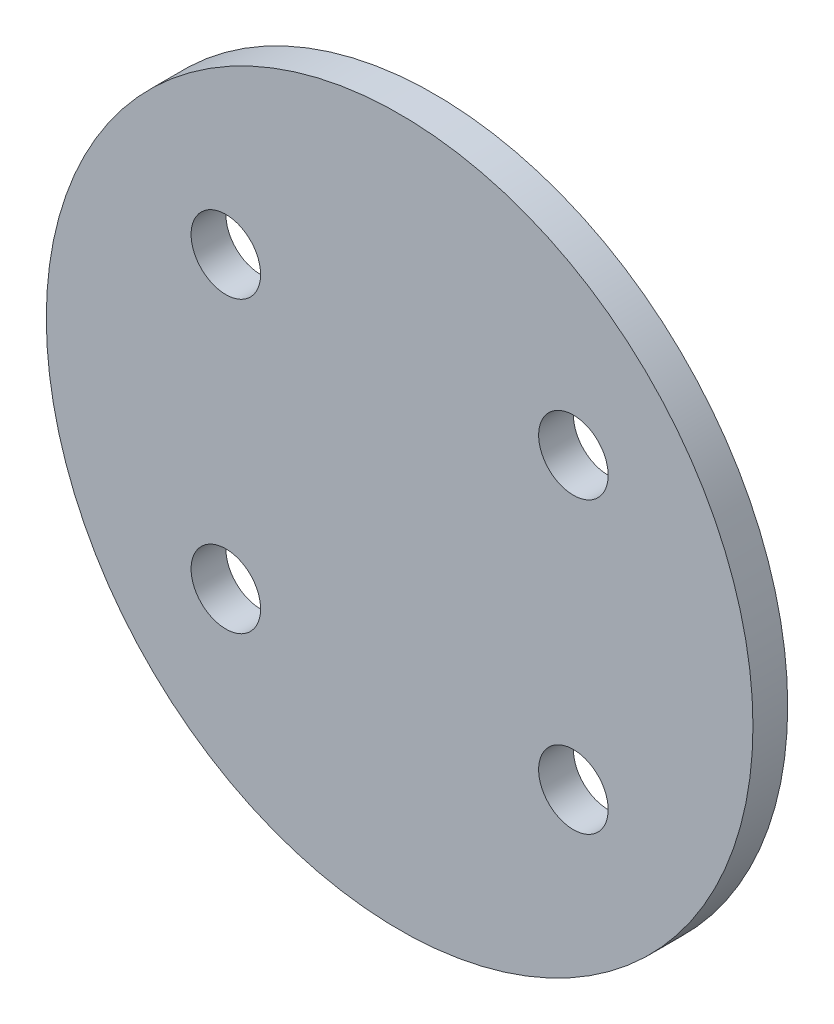
ISO-10303-21;
HEADER;
FILE_DESCRIPTION(('STEP AP214'),'2;1');
FILE_NAME('part.step','',(''),(''),'','','');
FILE_SCHEMA(('AUTOMOTIVE_DESIGN { 1 0 10303 214 1 1 1 1 }'));
ENDSEC;
DATA;
#1=APPLICATION_CONTEXT('core data for automotive mechanical design processes');
#2=APPLICATION_PROTOCOL_DEFINITION('international standard','automotive_design',2000,#1);
#3=PRODUCT_CONTEXT('',#1,'mechanical');
#4=PRODUCT('Part','Part','',(#3));
#5=PRODUCT_RELATED_PRODUCT_CATEGORY('part','',(#4));
#6=PRODUCT_DEFINITION_FORMATION('','',#4);
#7=PRODUCT_DEFINITION_CONTEXT('part definition',#1,'design');
#8=PRODUCT_DEFINITION('design','',#6,#7);
#9=PRODUCT_DEFINITION_SHAPE('','',#8);
#10=(LENGTH_UNIT() NAMED_UNIT(*) SI_UNIT(.MILLI.,.METRE.));
#11=(NAMED_UNIT(*) PLANE_ANGLE_UNIT() SI_UNIT($,.RADIAN.));
#12=(NAMED_UNIT(*) SI_UNIT($,.STERADIAN.) SOLID_ANGLE_UNIT());
#13=UNCERTAINTY_MEASURE_WITH_UNIT(LENGTH_MEASURE(1.E-05),#10,'distance_accuracy_value','');
#14=(GEOMETRIC_REPRESENTATION_CONTEXT(3) GLOBAL_UNCERTAINTY_ASSIGNED_CONTEXT((#13)) GLOBAL_UNIT_ASSIGNED_CONTEXT((#10,
#11,#12)) REPRESENTATION_CONTEXT('',''));
#15=CARTESIAN_POINT('',(0.,0.,0.));
#16=DIRECTION('',(0.,0.,1.));
#17=DIRECTION('',(1.,0.,0.));
#18=AXIS2_PLACEMENT_3D('',#15,#16,#17);
#19=CARTESIAN_POINT('',(0.,0.,3.));
#20=DIRECTION('',(0.,0.,1.));
#21=DIRECTION('',(1.,0.,0.));
#22=AXIS2_PLACEMENT_3D('',#19,#20,#21);
#23=PLANE('',#22);
#24=CARTESIAN_POINT('',(-15.,-12.5,3.));
#25=DIRECTION('',(0.,0.,1.));
#26=DIRECTION('',(1.,0.,0.));
#27=AXIS2_PLACEMENT_3D('',#24,#25,#26);
#28=CIRCLE('',#27,3.);
#29=CARTESIAN_POINT('',(-12.,-12.5,3.));
#30=VERTEX_POINT('',#29);
#31=EDGE_CURVE('E52',#30,#30,#28,.T.);
#32=ORIENTED_EDGE('',*,*,#31,.F.);
#33=EDGE_LOOP('',(#32));
#34=FACE_BOUND('',#33,.T.);
#35=CARTESIAN_POINT('',(15.,12.5,3.));
#36=DIRECTION('',(0.,0.,1.));
#37=DIRECTION('',(1.,0.,0.));
#38=AXIS2_PLACEMENT_3D('',#35,#36,#37);
#39=CIRCLE('',#38,3.);
#40=CARTESIAN_POINT('',(18.,12.5,3.));
#41=VERTEX_POINT('',#40);
#42=EDGE_CURVE('E41',#41,#41,#39,.T.);
#43=ORIENTED_EDGE('',*,*,#42,.F.);
#44=EDGE_LOOP('',(#43));
#45=FACE_BOUND('',#44,.T.);
#46=CARTESIAN_POINT('',(0.,0.,3.));
#47=DIRECTION('',(0.,0.,1.));
#48=DIRECTION('',(1.,0.,0.));
#49=AXIS2_PLACEMENT_3D('',#46,#47,#48);
#50=CIRCLE('',#49,30.5);
#51=CARTESIAN_POINT('',(30.5,0.,3.));
#52=VERTEX_POINT('',#51);
#53=EDGE_CURVE('E10',#52,#52,#50,.T.);
#54=ORIENTED_EDGE('',*,*,#53,.T.);
#55=EDGE_LOOP('',(#54));
#56=FACE_BOUND('',#55,.T.);
#57=CARTESIAN_POINT('',(15.,-12.5,3.));
#58=DIRECTION('',(0.,0.,1.));
#59=DIRECTION('',(1.,0.,0.));
#60=AXIS2_PLACEMENT_3D('',#57,#58,#59);
#61=CIRCLE('',#60,3.);
#62=CARTESIAN_POINT('',(18.,-12.5,3.));
#63=VERTEX_POINT('',#62);
#64=EDGE_CURVE('E46',#63,#63,#61,.T.);
#65=ORIENTED_EDGE('',*,*,#64,.F.);
#66=EDGE_LOOP('',(#65));
#67=FACE_BOUND('',#66,.T.);
#68=CARTESIAN_POINT('',(-15.,12.5,3.));
#69=DIRECTION('',(0.,0.,1.));
#70=DIRECTION('',(1.,0.,0.));
#71=AXIS2_PLACEMENT_3D('',#68,#69,#70);
#72=CIRCLE('',#71,3.);
#73=CARTESIAN_POINT('',(-12.,12.5,3.));
#74=VERTEX_POINT('',#73);
#75=EDGE_CURVE('E58',#74,#74,#72,.T.);
#76=ORIENTED_EDGE('',*,*,#75,.F.);
#77=EDGE_LOOP('',(#76));
#78=FACE_BOUND('',#77,.T.);
#79=ADVANCED_FACE('F30',(#34,#45,#56,#67,#78),#23,.T.);
#80=CARTESIAN_POINT('',(0.,0.,0.));
#81=DIRECTION('',(0.,0.,1.));
#82=DIRECTION('',(1.,0.,0.));
#83=AXIS2_PLACEMENT_3D('',#80,#81,#82);
#84=PLANE('',#83);
#85=CARTESIAN_POINT('',(-15.,-12.5,0.));
#86=DIRECTION('',(0.,0.,1.));
#87=DIRECTION('',(1.,0.,0.));
#88=AXIS2_PLACEMENT_3D('',#85,#86,#87);
#89=CIRCLE('',#88,3.);
#90=CARTESIAN_POINT('',(-12.,-12.5,0.));
#91=VERTEX_POINT('',#90);
#92=EDGE_CURVE('E55',#91,#91,#89,.T.);
#93=ORIENTED_EDGE('',*,*,#92,.T.);
#94=EDGE_LOOP('',(#93));
#95=FACE_BOUND('',#94,.T.);
#96=CARTESIAN_POINT('',(15.,12.5,0.));
#97=DIRECTION('',(0.,0.,1.));
#98=DIRECTION('',(1.,0.,0.));
#99=AXIS2_PLACEMENT_3D('',#96,#97,#98);
#100=CIRCLE('',#99,3.);
#101=CARTESIAN_POINT('',(18.,12.5,0.));
#102=VERTEX_POINT('',#101);
#103=EDGE_CURVE('E43',#102,#102,#100,.T.);
#104=ORIENTED_EDGE('',*,*,#103,.T.);
#105=EDGE_LOOP('',(#104));
#106=FACE_BOUND('',#105,.T.);
#107=CARTESIAN_POINT('',(0.,0.,0.));
#108=DIRECTION('',(0.,0.,1.));
#109=DIRECTION('',(1.,0.,0.));
#110=AXIS2_PLACEMENT_3D('',#107,#108,#109);
#111=CIRCLE('',#110,30.5);
#112=CARTESIAN_POINT('',(30.5,0.,0.));
#113=VERTEX_POINT('',#112);
#114=EDGE_CURVE('E34',#113,#113,#111,.T.);
#115=ORIENTED_EDGE('',*,*,#114,.F.);
#116=EDGE_LOOP('',(#115));
#117=FACE_BOUND('',#116,.T.);
#118=CARTESIAN_POINT('',(15.,-12.5,0.));
#119=DIRECTION('',(0.,0.,1.));
#120=DIRECTION('',(1.,0.,0.));
#121=AXIS2_PLACEMENT_3D('',#118,#119,#120);
#122=CIRCLE('',#121,3.);
#123=CARTESIAN_POINT('',(18.,-12.5,0.));
#124=VERTEX_POINT('',#123);
#125=EDGE_CURVE('E49',#124,#124,#122,.T.);
#126=ORIENTED_EDGE('',*,*,#125,.T.);
#127=EDGE_LOOP('',(#126));
#128=FACE_BOUND('',#127,.T.);
#129=CARTESIAN_POINT('',(-15.,12.5,0.));
#130=DIRECTION('',(0.,0.,1.));
#131=DIRECTION('',(1.,0.,0.));
#132=AXIS2_PLACEMENT_3D('',#129,#130,#131);
#133=CIRCLE('',#132,3.);
#134=CARTESIAN_POINT('',(-12.,12.5,0.));
#135=VERTEX_POINT('',#134);
#136=EDGE_CURVE('E61',#135,#135,#133,.T.);
#137=ORIENTED_EDGE('',*,*,#136,.T.);
#138=EDGE_LOOP('',(#137));
#139=FACE_BOUND('',#138,.T.);
#140=ADVANCED_FACE('F71',(#95,#106,#117,#128,#139),#84,.F.);
#141=CARTESIAN_POINT('',(0.,0.,3.));
#142=DIRECTION('',(0.,0.,-1.));
#143=DIRECTION('',(-1.,0.,0.));
#144=AXIS2_PLACEMENT_3D('',#141,#142,#143);
#145=CYLINDRICAL_SURFACE('',#144,30.5);
#146=ORIENTED_EDGE('',*,*,#53,.F.);
#147=EDGE_LOOP('',(#146));
#148=FACE_BOUND('',#147,.T.);
#149=ORIENTED_EDGE('',*,*,#114,.T.);
#150=EDGE_LOOP('',(#149));
#151=FACE_BOUND('',#150,.T.);
#152=ADVANCED_FACE('F32',(#148,#151),#145,.T.);
#153=CARTESIAN_POINT('',(15.,12.5,3.));
#154=DIRECTION('',(0.,0.,-1.));
#155=DIRECTION('',(-1.,0.,0.));
#156=AXIS2_PLACEMENT_3D('',#153,#154,#155);
#157=CYLINDRICAL_SURFACE('',#156,3.);
#158=ORIENTED_EDGE('',*,*,#42,.T.);
#159=EDGE_LOOP('',(#158));
#160=FACE_BOUND('',#159,.T.);
#161=ORIENTED_EDGE('',*,*,#103,.F.);
#162=EDGE_LOOP('',(#161));
#163=FACE_BOUND('',#162,.T.);
#164=ADVANCED_FACE('F81',(#160,#163),#157,.F.);
#165=CARTESIAN_POINT('',(15.,-12.5,3.));
#166=DIRECTION('',(0.,0.,-1.));
#167=DIRECTION('',(-1.,0.,0.));
#168=AXIS2_PLACEMENT_3D('',#165,#166,#167);
#169=CYLINDRICAL_SURFACE('',#168,3.);
#170=ORIENTED_EDGE('',*,*,#64,.T.);
#171=EDGE_LOOP('',(#170));
#172=FACE_BOUND('',#171,.T.);
#173=ORIENTED_EDGE('',*,*,#125,.F.);
#174=EDGE_LOOP('',(#173));
#175=FACE_BOUND('',#174,.T.);
#176=ADVANCED_FACE('F84',(#172,#175),#169,.F.);
#177=CARTESIAN_POINT('',(-15.,-12.5,3.));
#178=DIRECTION('',(0.,0.,-1.));
#179=DIRECTION('',(-1.,0.,0.));
#180=AXIS2_PLACEMENT_3D('',#177,#178,#179);
#181=CYLINDRICAL_SURFACE('',#180,3.);
#182=ORIENTED_EDGE('',*,*,#31,.T.);
#183=EDGE_LOOP('',(#182));
#184=FACE_BOUND('',#183,.T.);
#185=ORIENTED_EDGE('',*,*,#92,.F.);
#186=EDGE_LOOP('',(#185));
#187=FACE_BOUND('',#186,.T.);
#188=ADVANCED_FACE('F88',(#184,#187),#181,.F.);
#189=CARTESIAN_POINT('',(-15.,12.5,3.));
#190=DIRECTION('',(0.,0.,-1.));
#191=DIRECTION('',(-1.,0.,0.));
#192=AXIS2_PLACEMENT_3D('',#189,#190,#191);
#193=CYLINDRICAL_SURFACE('',#192,3.);
#194=ORIENTED_EDGE('',*,*,#75,.T.);
#195=EDGE_LOOP('',(#194));
#196=FACE_BOUND('',#195,.T.);
#197=ORIENTED_EDGE('',*,*,#136,.F.);
#198=EDGE_LOOP('',(#197));
#199=FACE_BOUND('',#198,.T.);
#200=ADVANCED_FACE('F67',(#196,#199),#193,.F.);
#201=CLOSED_SHELL('',(#79,#140,#152,#164,#176,#188,#200));
#202=MANIFOLD_SOLID_BREP('B2',#201);
#203=ADVANCED_BREP_SHAPE_REPRESENTATION('',(#18,#202),#14);
#204=SHAPE_DEFINITION_REPRESENTATION(#9,#203);
ENDSEC;
END-ISO-10303-21;
